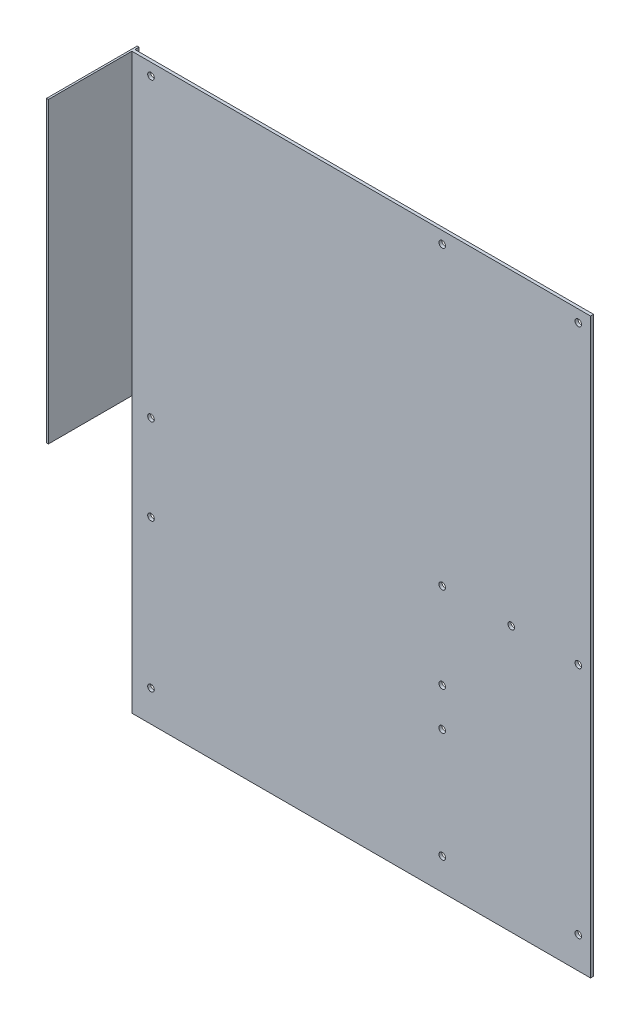
ISO-10303-21;
HEADER;
FILE_DESCRIPTION(('STEP AP214'),'2;1');
FILE_NAME('part.step','',(''),(''),'','','');
FILE_SCHEMA(('AUTOMOTIVE_DESIGN { 1 0 10303 214 1 1 1 1 }'));
ENDSEC;
DATA;
#1=APPLICATION_CONTEXT('core data for automotive mechanical design processes');
#2=APPLICATION_PROTOCOL_DEFINITION('international standard','automotive_design',2000,#1);
#3=PRODUCT_CONTEXT('',#1,'mechanical');
#4=PRODUCT('Part','Part','',(#3));
#5=PRODUCT_RELATED_PRODUCT_CATEGORY('part','',(#4));
#6=PRODUCT_DEFINITION_FORMATION('','',#4);
#7=PRODUCT_DEFINITION_CONTEXT('part definition',#1,'design');
#8=PRODUCT_DEFINITION('design','',#6,#7);
#9=PRODUCT_DEFINITION_SHAPE('','',#8);
#10=(LENGTH_UNIT() NAMED_UNIT(*) SI_UNIT(.MILLI.,.METRE.));
#11=(NAMED_UNIT(*) PLANE_ANGLE_UNIT() SI_UNIT($,.RADIAN.));
#12=(NAMED_UNIT(*) SI_UNIT($,.STERADIAN.) SOLID_ANGLE_UNIT());
#13=UNCERTAINTY_MEASURE_WITH_UNIT(LENGTH_MEASURE(1.E-05),#10,'distance_accuracy_value','');
#14=(GEOMETRIC_REPRESENTATION_CONTEXT(3) GLOBAL_UNCERTAINTY_ASSIGNED_CONTEXT((#13)) GLOBAL_UNIT_ASSIGNED_CONTEXT((#10,
#11,#12)) REPRESENTATION_CONTEXT('',''));
#15=CARTESIAN_POINT('',(0.,0.,0.));
#16=DIRECTION('',(0.,0.,1.));
#17=DIRECTION('',(1.,0.,0.));
#18=AXIS2_PLACEMENT_3D('',#15,#16,#17);
#19=CARTESIAN_POINT('',(0.,305.,1.6));
#20=DIRECTION('',(1.,0.,0.));
#21=DIRECTION('',(0.,0.,-1.));
#22=AXIS2_PLACEMENT_3D('',#19,#20,#21);
#23=PLANE('',#22);
#24=DIRECTION('',(0.,0.,1.));
#25=VECTOR('',#24,1.);
#26=CARTESIAN_POINT('',(0.,146.25,-2.21));
#27=LINE('',#26,#25);
#28=CARTESIAN_POINT('',(0.,146.25,0.));
#29=VERTEX_POINT('',#28);
#30=CARTESIAN_POINT('',(0.,146.25,1.6));
#31=VERTEX_POINT('',#30);
#32=EDGE_CURVE('E11',#29,#31,#27,.T.);
#33=ORIENTED_EDGE('',*,*,#32,.F.);
#34=DIRECTION('',(0.,-1.,0.));
#35=VECTOR('',#34,1.);
#36=CARTESIAN_POINT('',(0.,305.,0.));
#37=LINE('',#36,#35);
#38=CARTESIAN_POINT('',(0.,0.,0.));
#39=VERTEX_POINT('',#38);
#40=EDGE_CURVE('E288',#29,#39,#37,.T.);
#41=ORIENTED_EDGE('',*,*,#40,.T.);
#42=DIRECTION('',(0.,0.,-1.));
#43=VECTOR('',#42,1.);
#44=CARTESIAN_POINT('',(0.,0.,1.6));
#45=LINE('',#44,#43);
#46=CARTESIAN_POINT('',(0.,0.,1.6));
#47=VERTEX_POINT('',#46);
#48=EDGE_CURVE('E54',#47,#39,#45,.T.);
#49=ORIENTED_EDGE('',*,*,#48,.F.);
#50=DIRECTION('',(0.,-1.,0.));
#51=VECTOR('',#50,1.);
#52=CARTESIAN_POINT('',(0.,305.,1.6));
#53=LINE('',#52,#51);
#54=EDGE_CURVE('E102',#31,#47,#53,.T.);
#55=ORIENTED_EDGE('',*,*,#54,.F.);
#56=EDGE_LOOP('',(#33,#41,#49,#55));
#57=FACE_BOUND('',#56,.T.);
#58=ADVANCED_FACE('F51',(#57),#23,.F.);
#59=CARTESIAN_POINT('',(0.,0.,1.6));
#60=DIRECTION('',(0.,1.,0.));
#61=DIRECTION('',(0.,0.,1.));
#62=AXIS2_PLACEMENT_3D('',#59,#60,#61);
#63=PLANE('',#62);
#64=DIRECTION('',(1.,0.,0.));
#65=VECTOR('',#64,1.);
#66=CARTESIAN_POINT('',(0.,0.,0.));
#67=LINE('',#66,#65);
#68=CARTESIAN_POINT('',(244.,0.,0.));
#69=VERTEX_POINT('',#68);
#70=EDGE_CURVE('E307',#39,#69,#67,.T.);
#71=ORIENTED_EDGE('',*,*,#70,.T.);
#72=DIRECTION('',(0.,0.,-1.));
#73=VECTOR('',#72,1.);
#74=CARTESIAN_POINT('',(244.,0.,1.6));
#75=LINE('',#74,#73);
#76=CARTESIAN_POINT('',(244.,0.,1.6));
#77=VERTEX_POINT('',#76);
#78=EDGE_CURVE('E316',#77,#69,#75,.T.);
#79=ORIENTED_EDGE('',*,*,#78,.F.);
#80=DIRECTION('',(1.,0.,0.));
#81=VECTOR('',#80,1.);
#82=CARTESIAN_POINT('',(0.,0.,1.6));
#83=LINE('',#82,#81);
#84=EDGE_CURVE('E294',#47,#77,#83,.T.);
#85=ORIENTED_EDGE('',*,*,#84,.F.);
#86=ORIENTED_EDGE('',*,*,#48,.T.);
#87=EDGE_LOOP('',(#71,#79,#85,#86));
#88=FACE_BOUND('',#87,.T.);
#89=ADVANCED_FACE('F327',(#88),#63,.F.);
#90=CARTESIAN_POINT('',(244.,0.,1.6));
#91=DIRECTION('',(-1.,0.,0.));
#92=DIRECTION('',(0.,0.,1.));
#93=AXIS2_PLACEMENT_3D('',#90,#91,#92);
#94=PLANE('',#93);
#95=DIRECTION('',(0.,1.,0.));
#96=VECTOR('',#95,1.);
#97=CARTESIAN_POINT('',(244.,0.,0.));
#98=LINE('',#97,#96);
#99=CARTESIAN_POINT('',(244.,305.,0.));
#100=VERTEX_POINT('',#99);
#101=EDGE_CURVE('E310',#69,#100,#98,.T.);
#102=ORIENTED_EDGE('',*,*,#101,.T.);
#103=DIRECTION('',(0.,0.,-1.));
#104=VECTOR('',#103,1.);
#105=CARTESIAN_POINT('',(244.,305.,1.6));
#106=LINE('',#105,#104);
#107=CARTESIAN_POINT('',(244.,305.,1.6));
#108=VERTEX_POINT('',#107);
#109=EDGE_CURVE('E302',#108,#100,#106,.T.);
#110=ORIENTED_EDGE('',*,*,#109,.F.);
#111=DIRECTION('',(0.,1.,0.));
#112=VECTOR('',#111,1.);
#113=CARTESIAN_POINT('',(244.,0.,1.6));
#114=LINE('',#113,#112);
#115=EDGE_CURVE('E297',#77,#108,#114,.T.);
#116=ORIENTED_EDGE('',*,*,#115,.F.);
#117=ORIENTED_EDGE('',*,*,#78,.T.);
#118=EDGE_LOOP('',(#102,#110,#116,#117));
#119=FACE_BOUND('',#118,.T.);
#120=ADVANCED_FACE('F333',(#119),#94,.F.);
#121=CARTESIAN_POINT('',(244.,305.,1.6));
#122=DIRECTION('',(0.,-1.,0.));
#123=DIRECTION('',(1.,0.,0.));
#124=AXIS2_PLACEMENT_3D('',#121,#122,#123);
#125=PLANE('',#124);
#126=DIRECTION('',(-1.,0.,0.));
#127=VECTOR('',#126,1.);
#128=CARTESIAN_POINT('',(244.,305.,0.));
#129=LINE('',#128,#127);
#130=CARTESIAN_POINT('',(0.,305.,0.));
#131=VERTEX_POINT('',#130);
#132=EDGE_CURVE('E97',#100,#131,#129,.T.);
#133=ORIENTED_EDGE('',*,*,#132,.T.);
#134=DIRECTION('',(0.,0.,1.));
#135=VECTOR('',#134,1.);
#136=CARTESIAN_POINT('',(0.,305.,-2.21));
#137=LINE('',#136,#135);
#138=CARTESIAN_POINT('',(0.,305.,-2.21));
#139=VERTEX_POINT('',#138);
#140=EDGE_CURVE('E139',#139,#131,#137,.T.);
#141=ORIENTED_EDGE('',*,*,#140,.F.);
#142=DIRECTION('',(-1.,0.,0.));
#143=VECTOR('',#142,1.);
#144=CARTESIAN_POINT('',(0.,305.,-2.21));
#145=LINE('',#144,#143);
#146=CARTESIAN_POINT('',(-1.,305.,-2.21));
#147=VERTEX_POINT('',#146);
#148=EDGE_CURVE('E168',#139,#147,#145,.T.);
#149=ORIENTED_EDGE('',*,*,#148,.T.);
#150=DIRECTION('',(0.,0.,1.));
#151=VECTOR('',#150,1.);
#152=CARTESIAN_POINT('',(-1.,305.,-2.21));
#153=LINE('',#152,#151);
#154=CARTESIAN_POINT('',(-1.,305.,46.05));
#155=VERTEX_POINT('',#154);
#156=EDGE_CURVE('E146',#147,#155,#153,.T.);
#157=ORIENTED_EDGE('',*,*,#156,.T.);
#158=DIRECTION('',(-1.,0.,0.));
#159=VECTOR('',#158,1.);
#160=CARTESIAN_POINT('',(0.,305.,46.05));
#161=LINE('',#160,#159);
#162=CARTESIAN_POINT('',(0.,305.,46.05));
#163=VERTEX_POINT('',#162);
#164=EDGE_CURVE('E143',#163,#155,#161,.T.);
#165=ORIENTED_EDGE('',*,*,#164,.F.);
#166=CARTESIAN_POINT('',(0.,305.,1.6));
#167=VERTEX_POINT('',#166);
#168=EDGE_CURVE('E131',#167,#163,#137,.T.);
#169=ORIENTED_EDGE('',*,*,#168,.F.);
#170=DIRECTION('',(-1.,0.,0.));
#171=VECTOR('',#170,1.);
#172=CARTESIAN_POINT('',(244.,305.,1.6));
#173=LINE('',#172,#171);
#174=EDGE_CURVE('E76',#108,#167,#173,.T.);
#175=ORIENTED_EDGE('',*,*,#174,.F.);
#176=ORIENTED_EDGE('',*,*,#109,.T.);
#177=EDGE_LOOP('',(#133,#141,#149,#157,#165,#169,#175,#176));
#178=FACE_BOUND('',#177,.T.);
#179=ADVANCED_FACE('F144',(#178),#125,.F.);
#180=CARTESIAN_POINT('',(0.,0.,1.6));
#181=DIRECTION('',(0.,0.,1.));
#182=DIRECTION('',(1.,0.,0.));
#183=AXIS2_PLACEMENT_3D('',#180,#181,#182);
#184=PLANE('',#183);
#185=CARTESIAN_POINT('',(165.1,95.43,1.6));
#186=DIRECTION('',(0.,0.,1.));
#187=DIRECTION('',(1.,0.,0.));
#188=AXIS2_PLACEMENT_3D('',#185,#186,#187);
#189=CIRCLE('',#188,1.75000000000001);
#190=CARTESIAN_POINT('',(166.85,95.43,1.6));
#191=VERTEX_POINT('',#190);
#192=EDGE_CURVE('E236',#191,#191,#189,.T.);
#193=ORIENTED_EDGE('',*,*,#192,.F.);
#194=EDGE_LOOP('',(#193));
#195=FACE_BOUND('',#194,.T.);
#196=CARTESIAN_POINT('',(10.16,141.15,1.6));
#197=DIRECTION('',(0.,0.,1.));
#198=DIRECTION('',(1.,0.,0.));
#199=AXIS2_PLACEMENT_3D('',#196,#197,#198);
#200=CIRCLE('',#199,1.75);
#201=CARTESIAN_POINT('',(11.91,141.15,1.6));
#202=VERTEX_POINT('',#201);
#203=EDGE_CURVE('E245',#202,#202,#200,.T.);
#204=ORIENTED_EDGE('',*,*,#203,.F.);
#205=EDGE_LOOP('',(#204));
#206=FACE_BOUND('',#205,.T.);
#207=CARTESIAN_POINT('',(165.1,141.15,1.6));
#208=DIRECTION('',(0.,0.,1.));
#209=DIRECTION('',(1.,0.,0.));
#210=AXIS2_PLACEMENT_3D('',#207,#208,#209);
#211=CIRCLE('',#210,1.75000000000001);
#212=CARTESIAN_POINT('',(166.85,141.15,1.6));
#213=VERTEX_POINT('',#212);
#214=EDGE_CURVE('E220',#213,#213,#211,.T.);
#215=ORIENTED_EDGE('',*,*,#214,.F.);
#216=EDGE_LOOP('',(#215));
#217=FACE_BOUND('',#216,.T.);
#218=CARTESIAN_POINT('',(237.49,141.15,1.6));
#219=DIRECTION('',(0.,0.,1.));
#220=DIRECTION('',(1.,0.,0.));
#221=AXIS2_PLACEMENT_3D('',#218,#219,#220);
#222=CIRCLE('',#221,1.75000000000001);
#223=CARTESIAN_POINT('',(239.24,141.15,1.6));
#224=VERTEX_POINT('',#223);
#225=EDGE_CURVE('E229',#224,#224,#222,.T.);
#226=ORIENTED_EDGE('',*,*,#225,.F.);
#227=EDGE_LOOP('',(#226));
#228=FACE_BOUND('',#227,.T.);
#229=CARTESIAN_POINT('',(10.16,95.43,1.6));
#230=DIRECTION('',(0.,0.,1.));
#231=DIRECTION('',(1.,0.,0.));
#232=AXIS2_PLACEMENT_3D('',#229,#230,#231);
#233=CIRCLE('',#232,1.75);
#234=CARTESIAN_POINT('',(11.91,95.43,1.6));
#235=VERTEX_POINT('',#234);
#236=EDGE_CURVE('E277',#235,#235,#233,.T.);
#237=ORIENTED_EDGE('',*,*,#236,.F.);
#238=EDGE_LOOP('',(#237));
#239=FACE_BOUND('',#238,.T.);
#240=CARTESIAN_POINT('',(165.1,75.11,1.6));
#241=DIRECTION('',(0.,0.,1.));
#242=DIRECTION('',(1.,0.,0.));
#243=AXIS2_PLACEMENT_3D('',#240,#241,#242);
#244=CIRCLE('',#243,1.75000000000001);
#245=CARTESIAN_POINT('',(166.85,75.11,1.6));
#246=VERTEX_POINT('',#245);
#247=EDGE_CURVE('E269',#246,#246,#244,.T.);
#248=ORIENTED_EDGE('',*,*,#247,.F.);
#249=EDGE_LOOP('',(#248));
#250=FACE_BOUND('',#249,.T.);
#251=CARTESIAN_POINT('',(237.49,16.69,1.6));
#252=DIRECTION('',(0.,0.,1.));
#253=DIRECTION('',(1.,0.,0.));
#254=AXIS2_PLACEMENT_3D('',#251,#252,#253);
#255=CIRCLE('',#254,1.75000000000001);
#256=CARTESIAN_POINT('',(239.24,16.69,1.6));
#257=VERTEX_POINT('',#256);
#258=EDGE_CURVE('E261',#257,#257,#255,.T.);
#259=ORIENTED_EDGE('',*,*,#258,.F.);
#260=EDGE_LOOP('',(#259));
#261=FACE_BOUND('',#260,.T.);
#262=CARTESIAN_POINT('',(165.1,16.69,1.6));
#263=DIRECTION('',(0.,0.,1.));
#264=DIRECTION('',(1.,0.,0.));
#265=AXIS2_PLACEMENT_3D('',#262,#263,#264);
#266=CIRCLE('',#265,1.75000000000001);
#267=CARTESIAN_POINT('',(166.85,16.69,1.6));
#268=VERTEX_POINT('',#267);
#269=EDGE_CURVE('E252',#268,#268,#266,.T.);
#270=ORIENTED_EDGE('',*,*,#269,.F.);
#271=EDGE_LOOP('',(#270));
#272=FACE_BOUND('',#271,.T.);
#273=CARTESIAN_POINT('',(10.16,298.63,1.6));
#274=DIRECTION('',(0.,0.,1.));
#275=DIRECTION('',(1.,0.,0.));
#276=AXIS2_PLACEMENT_3D('',#273,#274,#275);
#277=CIRCLE('',#276,1.75);
#278=CARTESIAN_POINT('',(11.91,298.63,1.6));
#279=VERTEX_POINT('',#278);
#280=EDGE_CURVE('E188',#279,#279,#277,.T.);
#281=ORIENTED_EDGE('',*,*,#280,.F.);
#282=EDGE_LOOP('',(#281));
#283=FACE_BOUND('',#282,.T.);
#284=CARTESIAN_POINT('',(165.1,298.63,1.6));
#285=DIRECTION('',(0.,0.,1.));
#286=DIRECTION('',(1.,0.,0.));
#287=AXIS2_PLACEMENT_3D('',#284,#285,#286);
#288=CIRCLE('',#287,1.75000000000001);
#289=CARTESIAN_POINT('',(166.85,298.63,1.6));
#290=VERTEX_POINT('',#289);
#291=EDGE_CURVE('E197',#290,#290,#288,.T.);
#292=ORIENTED_EDGE('',*,*,#291,.F.);
#293=EDGE_LOOP('',(#292));
#294=FACE_BOUND('',#293,.T.);
#295=CARTESIAN_POINT('',(237.49,298.63,1.6));
#296=DIRECTION('',(0.,0.,1.));
#297=DIRECTION('',(1.,0.,0.));
#298=AXIS2_PLACEMENT_3D('',#295,#296,#297);
#299=CIRCLE('',#298,1.75000000000001);
#300=CARTESIAN_POINT('',(239.24,298.63,1.6));
#301=VERTEX_POINT('',#300);
#302=EDGE_CURVE('E205',#301,#301,#299,.T.);
#303=ORIENTED_EDGE('',*,*,#302,.F.);
#304=EDGE_LOOP('',(#303));
#305=FACE_BOUND('',#304,.T.);
#306=CARTESIAN_POINT('',(201.816,141.15,1.6));
#307=DIRECTION('',(0.,0.,1.));
#308=DIRECTION('',(1.,0.,0.));
#309=AXIS2_PLACEMENT_3D('',#306,#307,#308);
#310=CIRCLE('',#309,1.75000000000001);
#311=CARTESIAN_POINT('',(203.566,141.15,1.6));
#312=VERTEX_POINT('',#311);
#313=EDGE_CURVE('E213',#312,#312,#310,.T.);
#314=ORIENTED_EDGE('',*,*,#313,.F.);
#315=EDGE_LOOP('',(#314));
#316=FACE_BOUND('',#315,.T.);
#317=CARTESIAN_POINT('',(10.16,16.69,1.6));
#318=DIRECTION('',(0.,0.,1.));
#319=DIRECTION('',(1.,0.,0.));
#320=AXIS2_PLACEMENT_3D('',#317,#318,#319);
#321=CIRCLE('',#320,1.75);
#322=CARTESIAN_POINT('',(11.91,16.69,1.6));
#323=VERTEX_POINT('',#322);
#324=EDGE_CURVE('E256',#323,#323,#321,.T.);
#325=ORIENTED_EDGE('',*,*,#324,.F.);
#326=EDGE_LOOP('',(#325));
#327=FACE_BOUND('',#326,.T.);
#328=EDGE_CURVE('E137',#167,#31,#53,.T.);
#329=ORIENTED_EDGE('',*,*,#328,.T.);
#330=ORIENTED_EDGE('',*,*,#54,.T.);
#331=ORIENTED_EDGE('',*,*,#84,.T.);
#332=ORIENTED_EDGE('',*,*,#115,.T.);
#333=ORIENTED_EDGE('',*,*,#174,.T.);
#334=EDGE_LOOP('',(#329,#330,#331,#332,#333));
#335=FACE_BOUND('',#334,.T.);
#336=ADVANCED_FACE('F334',(#195,#206,#217,#228,#239,#250,#261,#272,#283,#294,#305,#316,#327,
#335),#184,.T.);
#337=CARTESIAN_POINT('',(0.,0.,0.));
#338=DIRECTION('',(0.,0.,1.));
#339=DIRECTION('',(1.,0.,0.));
#340=AXIS2_PLACEMENT_3D('',#337,#338,#339);
#341=PLANE('',#340);
#342=CARTESIAN_POINT('',(165.1,95.43,0.));
#343=DIRECTION('',(0.,0.,1.));
#344=DIRECTION('',(1.,0.,0.));
#345=AXIS2_PLACEMENT_3D('',#342,#343,#344);
#346=CIRCLE('',#345,1.75000000000001);
#347=CARTESIAN_POINT('',(166.85,95.43,0.));
#348=VERTEX_POINT('',#347);
#349=EDGE_CURVE('E241',#348,#348,#346,.T.);
#350=ORIENTED_EDGE('',*,*,#349,.T.);
#351=EDGE_LOOP('',(#350));
#352=FACE_BOUND('',#351,.T.);
#353=CARTESIAN_POINT('',(10.16,141.15,0.));
#354=DIRECTION('',(0.,0.,1.));
#355=DIRECTION('',(1.,0.,0.));
#356=AXIS2_PLACEMENT_3D('',#353,#354,#355);
#357=CIRCLE('',#356,1.75);
#358=CARTESIAN_POINT('',(11.91,141.15,0.));
#359=VERTEX_POINT('',#358);
#360=EDGE_CURVE('E224',#359,#359,#357,.T.);
#361=ORIENTED_EDGE('',*,*,#360,.T.);
#362=EDGE_LOOP('',(#361));
#363=FACE_BOUND('',#362,.T.);
#364=CARTESIAN_POINT('',(165.1,141.15,0.));
#365=DIRECTION('',(0.,0.,1.));
#366=DIRECTION('',(1.,0.,0.));
#367=AXIS2_PLACEMENT_3D('',#364,#365,#366);
#368=CIRCLE('',#367,1.75000000000001);
#369=CARTESIAN_POINT('',(166.85,141.15,0.));
#370=VERTEX_POINT('',#369);
#371=EDGE_CURVE('E225',#370,#370,#368,.T.);
#372=ORIENTED_EDGE('',*,*,#371,.T.);
#373=EDGE_LOOP('',(#372));
#374=FACE_BOUND('',#373,.T.);
#375=CARTESIAN_POINT('',(237.49,141.15,0.));
#376=DIRECTION('',(0.,0.,1.));
#377=DIRECTION('',(1.,0.,0.));
#378=AXIS2_PLACEMENT_3D('',#375,#376,#377);
#379=CIRCLE('',#378,1.75000000000001);
#380=CARTESIAN_POINT('',(239.24,141.15,0.));
#381=VERTEX_POINT('',#380);
#382=EDGE_CURVE('E192',#381,#381,#379,.T.);
#383=ORIENTED_EDGE('',*,*,#382,.T.);
#384=EDGE_LOOP('',(#383));
#385=FACE_BOUND('',#384,.T.);
#386=CARTESIAN_POINT('',(10.16,95.43,0.));
#387=DIRECTION('',(0.,0.,1.));
#388=DIRECTION('',(1.,0.,0.));
#389=AXIS2_PLACEMENT_3D('',#386,#387,#388);
#390=CIRCLE('',#389,1.75);
#391=CARTESIAN_POINT('',(11.91,95.43,0.));
#392=VERTEX_POINT('',#391);
#393=EDGE_CURVE('E240',#392,#392,#390,.T.);
#394=ORIENTED_EDGE('',*,*,#393,.T.);
#395=EDGE_LOOP('',(#394));
#396=FACE_BOUND('',#395,.T.);
#397=CARTESIAN_POINT('',(165.1,75.11,0.));
#398=DIRECTION('',(0.,0.,1.));
#399=DIRECTION('',(1.,0.,0.));
#400=AXIS2_PLACEMENT_3D('',#397,#398,#399);
#401=CIRCLE('',#400,1.75000000000001);
#402=CARTESIAN_POINT('',(166.85,75.11,0.));
#403=VERTEX_POINT('',#402);
#404=EDGE_CURVE('E273',#403,#403,#401,.T.);
#405=ORIENTED_EDGE('',*,*,#404,.T.);
#406=EDGE_LOOP('',(#405));
#407=FACE_BOUND('',#406,.T.);
#408=CARTESIAN_POINT('',(237.49,16.69,0.));
#409=DIRECTION('',(0.,0.,1.));
#410=DIRECTION('',(1.,0.,0.));
#411=AXIS2_PLACEMENT_3D('',#408,#409,#410);
#412=CIRCLE('',#411,1.75000000000001);
#413=CARTESIAN_POINT('',(239.24,16.69,0.));
#414=VERTEX_POINT('',#413);
#415=EDGE_CURVE('E265',#414,#414,#412,.T.);
#416=ORIENTED_EDGE('',*,*,#415,.T.);
#417=EDGE_LOOP('',(#416));
#418=FACE_BOUND('',#417,.T.);
#419=CARTESIAN_POINT('',(165.1,16.69,0.));
#420=DIRECTION('',(0.,0.,1.));
#421=DIRECTION('',(1.,0.,0.));
#422=AXIS2_PLACEMENT_3D('',#419,#420,#421);
#423=CIRCLE('',#422,1.75000000000001);
#424=CARTESIAN_POINT('',(166.85,16.69,0.));
#425=VERTEX_POINT('',#424);
#426=EDGE_CURVE('E257',#425,#425,#423,.T.);
#427=ORIENTED_EDGE('',*,*,#426,.T.);
#428=EDGE_LOOP('',(#427));
#429=FACE_BOUND('',#428,.T.);
#430=CARTESIAN_POINT('',(10.16,298.63,0.));
#431=DIRECTION('',(0.,0.,1.));
#432=DIRECTION('',(1.,0.,0.));
#433=AXIS2_PLACEMENT_3D('',#430,#431,#432);
#434=CIRCLE('',#433,1.75);
#435=CARTESIAN_POINT('',(11.91,298.63,0.));
#436=VERTEX_POINT('',#435);
#437=EDGE_CURVE('E193',#436,#436,#434,.T.);
#438=ORIENTED_EDGE('',*,*,#437,.T.);
#439=EDGE_LOOP('',(#438));
#440=FACE_BOUND('',#439,.T.);
#441=CARTESIAN_POINT('',(165.1,298.63,0.));
#442=DIRECTION('',(0.,0.,1.));
#443=DIRECTION('',(1.,0.,0.));
#444=AXIS2_PLACEMENT_3D('',#441,#442,#443);
#445=CIRCLE('',#444,1.75000000000001);
#446=CARTESIAN_POINT('',(166.85,298.63,0.));
#447=VERTEX_POINT('',#446);
#448=EDGE_CURVE('E201',#447,#447,#445,.T.);
#449=ORIENTED_EDGE('',*,*,#448,.T.);
#450=EDGE_LOOP('',(#449));
#451=FACE_BOUND('',#450,.T.);
#452=CARTESIAN_POINT('',(237.49,298.63,0.));
#453=DIRECTION('',(0.,0.,1.));
#454=DIRECTION('',(1.,0.,0.));
#455=AXIS2_PLACEMENT_3D('',#452,#453,#454);
#456=CIRCLE('',#455,1.75000000000001);
#457=CARTESIAN_POINT('',(239.24,298.63,0.));
#458=VERTEX_POINT('',#457);
#459=EDGE_CURVE('E209',#458,#458,#456,.T.);
#460=ORIENTED_EDGE('',*,*,#459,.T.);
#461=EDGE_LOOP('',(#460));
#462=FACE_BOUND('',#461,.T.);
#463=CARTESIAN_POINT('',(201.816,141.15,0.));
#464=DIRECTION('',(0.,0.,1.));
#465=DIRECTION('',(1.,0.,0.));
#466=AXIS2_PLACEMENT_3D('',#463,#464,#465);
#467=CIRCLE('',#466,1.75000000000001);
#468=CARTESIAN_POINT('',(203.566,141.15,0.));
#469=VERTEX_POINT('',#468);
#470=EDGE_CURVE('E180',#469,#469,#467,.T.);
#471=ORIENTED_EDGE('',*,*,#470,.T.);
#472=EDGE_LOOP('',(#471));
#473=FACE_BOUND('',#472,.T.);
#474=CARTESIAN_POINT('',(10.16,16.69,0.));
#475=DIRECTION('',(0.,0.,1.));
#476=DIRECTION('',(1.,0.,0.));
#477=AXIS2_PLACEMENT_3D('',#474,#475,#476);
#478=CIRCLE('',#477,1.75);
#479=CARTESIAN_POINT('',(11.91,16.69,0.));
#480=VERTEX_POINT('',#479);
#481=EDGE_CURVE('E284',#480,#480,#478,.T.);
#482=ORIENTED_EDGE('',*,*,#481,.T.);
#483=EDGE_LOOP('',(#482));
#484=FACE_BOUND('',#483,.T.);
#485=EDGE_CURVE('E303',#131,#29,#37,.T.);
#486=ORIENTED_EDGE('',*,*,#485,.F.);
#487=ORIENTED_EDGE('',*,*,#132,.F.);
#488=ORIENTED_EDGE('',*,*,#101,.F.);
#489=ORIENTED_EDGE('',*,*,#70,.F.);
#490=ORIENTED_EDGE('',*,*,#40,.F.);
#491=EDGE_LOOP('',(#486,#487,#488,#489,#490));
#492=FACE_BOUND('',#491,.T.);
#493=ADVANCED_FACE('F331',(#352,#363,#374,#385,#396,#407,#418,#429,#440,#451,#462,#473,#484,
#492),#341,.F.);
#494=CARTESIAN_POINT('',(10.16,16.69,0.));
#495=DIRECTION('',(0.,0.,1.));
#496=DIRECTION('',(1.,0.,0.));
#497=AXIS2_PLACEMENT_3D('',#494,#495,#496);
#498=CYLINDRICAL_SURFACE('',#497,1.75);
#499=ORIENTED_EDGE('',*,*,#481,.F.);
#500=EDGE_LOOP('',(#499));
#501=FACE_BOUND('',#500,.T.);
#502=ORIENTED_EDGE('',*,*,#324,.T.);
#503=EDGE_LOOP('',(#502));
#504=FACE_BOUND('',#503,.T.);
#505=ADVANCED_FACE('F342',(#501,#504),#498,.F.);
#506=CARTESIAN_POINT('',(201.816,141.15,0.));
#507=DIRECTION('',(0.,0.,1.));
#508=DIRECTION('',(1.,0.,0.));
#509=AXIS2_PLACEMENT_3D('',#506,#507,#508);
#510=CYLINDRICAL_SURFACE('',#509,1.75000000000001);
#511=ORIENTED_EDGE('',*,*,#470,.F.);
#512=EDGE_LOOP('',(#511));
#513=FACE_BOUND('',#512,.T.);
#514=ORIENTED_EDGE('',*,*,#313,.T.);
#515=EDGE_LOOP('',(#514));
#516=FACE_BOUND('',#515,.T.);
#517=ADVANCED_FACE('F579',(#513,#516),#510,.F.);
#518=CARTESIAN_POINT('',(237.49,298.63,0.));
#519=DIRECTION('',(0.,0.,1.));
#520=DIRECTION('',(1.,0.,0.));
#521=AXIS2_PLACEMENT_3D('',#518,#519,#520);
#522=CYLINDRICAL_SURFACE('',#521,1.75000000000001);
#523=ORIENTED_EDGE('',*,*,#459,.F.);
#524=EDGE_LOOP('',(#523));
#525=FACE_BOUND('',#524,.T.);
#526=ORIENTED_EDGE('',*,*,#302,.T.);
#527=EDGE_LOOP('',(#526));
#528=FACE_BOUND('',#527,.T.);
#529=ADVANCED_FACE('F569',(#525,#528),#522,.F.);
#530=CARTESIAN_POINT('',(165.1,298.63,0.));
#531=DIRECTION('',(0.,0.,1.));
#532=DIRECTION('',(1.,0.,0.));
#533=AXIS2_PLACEMENT_3D('',#530,#531,#532);
#534=CYLINDRICAL_SURFACE('',#533,1.75000000000001);
#535=ORIENTED_EDGE('',*,*,#448,.F.);
#536=EDGE_LOOP('',(#535));
#537=FACE_BOUND('',#536,.T.);
#538=ORIENTED_EDGE('',*,*,#291,.T.);
#539=EDGE_LOOP('',(#538));
#540=FACE_BOUND('',#539,.T.);
#541=ADVANCED_FACE('F559',(#537,#540),#534,.F.);
#542=CARTESIAN_POINT('',(10.16,298.63,0.));
#543=DIRECTION('',(0.,0.,1.));
#544=DIRECTION('',(1.,0.,0.));
#545=AXIS2_PLACEMENT_3D('',#542,#543,#544);
#546=CYLINDRICAL_SURFACE('',#545,1.75);
#547=ORIENTED_EDGE('',*,*,#437,.F.);
#548=EDGE_LOOP('',(#547));
#549=FACE_BOUND('',#548,.T.);
#550=ORIENTED_EDGE('',*,*,#280,.T.);
#551=EDGE_LOOP('',(#550));
#552=FACE_BOUND('',#551,.T.);
#553=ADVANCED_FACE('F549',(#549,#552),#546,.F.);
#554=CARTESIAN_POINT('',(165.1,16.69,0.));
#555=DIRECTION('',(0.,0.,1.));
#556=DIRECTION('',(1.,0.,0.));
#557=AXIS2_PLACEMENT_3D('',#554,#555,#556);
#558=CYLINDRICAL_SURFACE('',#557,1.75000000000001);
#559=ORIENTED_EDGE('',*,*,#426,.F.);
#560=EDGE_LOOP('',(#559));
#561=FACE_BOUND('',#560,.T.);
#562=ORIENTED_EDGE('',*,*,#269,.T.);
#563=EDGE_LOOP('',(#562));
#564=FACE_BOUND('',#563,.T.);
#565=ADVANCED_FACE('F539',(#561,#564),#558,.F.);
#566=CARTESIAN_POINT('',(237.49,16.69,0.));
#567=DIRECTION('',(0.,0.,1.));
#568=DIRECTION('',(1.,0.,0.));
#569=AXIS2_PLACEMENT_3D('',#566,#567,#568);
#570=CYLINDRICAL_SURFACE('',#569,1.75000000000001);
#571=ORIENTED_EDGE('',*,*,#415,.F.);
#572=EDGE_LOOP('',(#571));
#573=FACE_BOUND('',#572,.T.);
#574=ORIENTED_EDGE('',*,*,#258,.T.);
#575=EDGE_LOOP('',(#574));
#576=FACE_BOUND('',#575,.T.);
#577=ADVANCED_FACE('F529',(#573,#576),#570,.F.);
#578=CARTESIAN_POINT('',(165.1,75.11,0.));
#579=DIRECTION('',(0.,0.,1.));
#580=DIRECTION('',(1.,0.,0.));
#581=AXIS2_PLACEMENT_3D('',#578,#579,#580);
#582=CYLINDRICAL_SURFACE('',#581,1.75000000000001);
#583=ORIENTED_EDGE('',*,*,#404,.F.);
#584=EDGE_LOOP('',(#583));
#585=FACE_BOUND('',#584,.T.);
#586=ORIENTED_EDGE('',*,*,#247,.T.);
#587=EDGE_LOOP('',(#586));
#588=FACE_BOUND('',#587,.T.);
#589=ADVANCED_FACE('F519',(#585,#588),#582,.F.);
#590=CARTESIAN_POINT('',(10.16,95.43,0.));
#591=DIRECTION('',(0.,0.,1.));
#592=DIRECTION('',(1.,0.,0.));
#593=AXIS2_PLACEMENT_3D('',#590,#591,#592);
#594=CYLINDRICAL_SURFACE('',#593,1.75);
#595=ORIENTED_EDGE('',*,*,#393,.F.);
#596=EDGE_LOOP('',(#595));
#597=FACE_BOUND('',#596,.T.);
#598=ORIENTED_EDGE('',*,*,#236,.T.);
#599=EDGE_LOOP('',(#598));
#600=FACE_BOUND('',#599,.T.);
#601=ADVANCED_FACE('F509',(#597,#600),#594,.F.);
#602=CARTESIAN_POINT('',(237.49,141.15,0.));
#603=DIRECTION('',(0.,0.,1.));
#604=DIRECTION('',(1.,0.,0.));
#605=AXIS2_PLACEMENT_3D('',#602,#603,#604);
#606=CYLINDRICAL_SURFACE('',#605,1.75000000000001);
#607=ORIENTED_EDGE('',*,*,#382,.F.);
#608=EDGE_LOOP('',(#607));
#609=FACE_BOUND('',#608,.T.);
#610=ORIENTED_EDGE('',*,*,#225,.T.);
#611=EDGE_LOOP('',(#610));
#612=FACE_BOUND('',#611,.T.);
#613=ADVANCED_FACE('F499',(#609,#612),#606,.F.);
#614=CARTESIAN_POINT('',(165.1,141.15,0.));
#615=DIRECTION('',(0.,0.,1.));
#616=DIRECTION('',(1.,0.,0.));
#617=AXIS2_PLACEMENT_3D('',#614,#615,#616);
#618=CYLINDRICAL_SURFACE('',#617,1.75000000000001);
#619=ORIENTED_EDGE('',*,*,#371,.F.);
#620=EDGE_LOOP('',(#619));
#621=FACE_BOUND('',#620,.T.);
#622=ORIENTED_EDGE('',*,*,#214,.T.);
#623=EDGE_LOOP('',(#622));
#624=FACE_BOUND('',#623,.T.);
#625=ADVANCED_FACE('F489',(#621,#624),#618,.F.);
#626=CARTESIAN_POINT('',(10.16,141.15,0.));
#627=DIRECTION('',(0.,0.,1.));
#628=DIRECTION('',(1.,0.,0.));
#629=AXIS2_PLACEMENT_3D('',#626,#627,#628);
#630=CYLINDRICAL_SURFACE('',#629,1.75);
#631=ORIENTED_EDGE('',*,*,#360,.F.);
#632=EDGE_LOOP('',(#631));
#633=FACE_BOUND('',#632,.T.);
#634=ORIENTED_EDGE('',*,*,#203,.T.);
#635=EDGE_LOOP('',(#634));
#636=FACE_BOUND('',#635,.T.);
#637=ADVANCED_FACE('F479',(#633,#636),#630,.F.);
#638=CARTESIAN_POINT('',(165.1,95.43,0.));
#639=DIRECTION('',(0.,0.,1.));
#640=DIRECTION('',(1.,0.,0.));
#641=AXIS2_PLACEMENT_3D('',#638,#639,#640);
#642=CYLINDRICAL_SURFACE('',#641,1.75000000000001);
#643=ORIENTED_EDGE('',*,*,#349,.F.);
#644=EDGE_LOOP('',(#643));
#645=FACE_BOUND('',#644,.T.);
#646=ORIENTED_EDGE('',*,*,#192,.T.);
#647=EDGE_LOOP('',(#646));
#648=FACE_BOUND('',#647,.T.);
#649=ADVANCED_FACE('F383',(#645,#648),#642,.F.);
#650=CARTESIAN_POINT('',(0.,305.,-2.21));
#651=DIRECTION('',(1.,0.,0.));
#652=DIRECTION('',(0.,0.,-1.));
#653=AXIS2_PLACEMENT_3D('',#650,#651,#652);
#654=PLANE('',#653);
#655=ORIENTED_EDGE('',*,*,#328,.F.);
#656=ORIENTED_EDGE('',*,*,#168,.T.);
#657=DIRECTION('',(0.,1.,0.));
#658=VECTOR('',#657,1.);
#659=CARTESIAN_POINT('',(0.,305.,46.05));
#660=LINE('',#659,#658);
#661=CARTESIAN_POINT('',(0.,146.25,46.05));
#662=VERTEX_POINT('',#661);
#663=EDGE_CURVE('E136',#662,#163,#660,.T.);
#664=ORIENTED_EDGE('',*,*,#663,.F.);
#665=EDGE_CURVE('E62',#31,#662,#27,.T.);
#666=ORIENTED_EDGE('',*,*,#665,.F.);
#667=EDGE_LOOP('',(#655,#656,#664,#666));
#668=FACE_BOUND('',#667,.T.);
#669=ADVANCED_FACE('F133',(#668),#654,.T.);
#670=ORIENTED_EDGE('',*,*,#140,.T.);
#671=ORIENTED_EDGE('',*,*,#485,.T.);
#672=CARTESIAN_POINT('',(0.,146.25,-2.21));
#673=VERTEX_POINT('',#672);
#674=EDGE_CURVE('E61',#673,#29,#27,.T.);
#675=ORIENTED_EDGE('',*,*,#674,.F.);
#676=DIRECTION('',(0.,1.,0.));
#677=VECTOR('',#676,1.);
#678=CARTESIAN_POINT('',(0.,305.,-2.21));
#679=LINE('',#678,#677);
#680=EDGE_CURVE('E164',#673,#139,#679,.T.);
#681=ORIENTED_EDGE('',*,*,#680,.T.);
#682=EDGE_LOOP('',(#670,#671,#675,#681));
#683=FACE_BOUND('',#682,.T.);
#684=ADVANCED_FACE('F382',(#683),#654,.T.);
#685=CARTESIAN_POINT('',(-0.999999999999984,146.25,-2.21));
#686=DIRECTION('',(0.,-1.,0.));
#687=DIRECTION('',(0.,0.,-1.));
#688=AXIS2_PLACEMENT_3D('',#685,#686,#687);
#689=PLANE('',#688);
#690=ORIENTED_EDGE('',*,*,#674,.T.);
#691=ORIENTED_EDGE('',*,*,#32,.T.);
#692=ORIENTED_EDGE('',*,*,#665,.T.);
#693=DIRECTION('',(1.,0.,0.));
#694=VECTOR('',#693,1.);
#695=CARTESIAN_POINT('',(-0.999999999999984,146.25,46.05));
#696=LINE('',#695,#694);
#697=CARTESIAN_POINT('',(-0.999999999999984,146.25,46.05));
#698=VERTEX_POINT('',#697);
#699=EDGE_CURVE('E156',#698,#662,#696,.T.);
#700=ORIENTED_EDGE('',*,*,#699,.F.);
#701=DIRECTION('',(0.,0.,1.));
#702=VECTOR('',#701,1.);
#703=CARTESIAN_POINT('',(-0.999999999999984,146.25,-2.21));
#704=LINE('',#703,#702);
#705=CARTESIAN_POINT('',(-0.999999999999984,146.25,-2.21));
#706=VERTEX_POINT('',#705);
#707=EDGE_CURVE('E181',#706,#698,#704,.T.);
#708=ORIENTED_EDGE('',*,*,#707,.F.);
#709=DIRECTION('',(1.,0.,0.));
#710=VECTOR('',#709,1.);
#711=CARTESIAN_POINT('',(-0.999999999999984,146.25,-2.21));
#712=LINE('',#711,#710);
#713=EDGE_CURVE('E140',#706,#673,#712,.T.);
#714=ORIENTED_EDGE('',*,*,#713,.T.);
#715=EDGE_LOOP('',(#690,#691,#692,#700,#708,#714));
#716=FACE_BOUND('',#715,.T.);
#717=ADVANCED_FACE('F392',(#716),#689,.T.);
#718=CARTESIAN_POINT('',(-1.,305.,-2.21));
#719=DIRECTION('',(-1.,0.,0.));
#720=DIRECTION('',(0.,-1.,0.));
#721=AXIS2_PLACEMENT_3D('',#718,#719,#720);
#722=PLANE('',#721);
#723=ORIENTED_EDGE('',*,*,#707,.T.);
#724=DIRECTION('',(0.,-1.,0.));
#725=VECTOR('',#724,1.);
#726=CARTESIAN_POINT('',(-1.,305.,46.05));
#727=LINE('',#726,#725);
#728=EDGE_CURVE('E151',#155,#698,#727,.T.);
#729=ORIENTED_EDGE('',*,*,#728,.F.);
#730=ORIENTED_EDGE('',*,*,#156,.F.);
#731=DIRECTION('',(0.,-1.,0.));
#732=VECTOR('',#731,1.);
#733=CARTESIAN_POINT('',(-1.,305.,-2.21));
#734=LINE('',#733,#732);
#735=EDGE_CURVE('E171',#147,#706,#734,.T.);
#736=ORIENTED_EDGE('',*,*,#735,.T.);
#737=EDGE_LOOP('',(#723,#729,#730,#736));
#738=FACE_BOUND('',#737,.T.);
#739=ADVANCED_FACE('F401',(#738),#722,.T.);
#740=CARTESIAN_POINT('',(0.,0.,-2.21));
#741=DIRECTION('',(0.,0.,1.));
#742=DIRECTION('',(1.,0.,0.));
#743=AXIS2_PLACEMENT_3D('',#740,#741,#742);
#744=PLANE('',#743);
#745=ORIENTED_EDGE('',*,*,#680,.F.);
#746=ORIENTED_EDGE('',*,*,#713,.F.);
#747=ORIENTED_EDGE('',*,*,#735,.F.);
#748=ORIENTED_EDGE('',*,*,#148,.F.);
#749=EDGE_LOOP('',(#745,#746,#747,#748));
#750=FACE_BOUND('',#749,.T.);
#751=ADVANCED_FACE('F411',(#750),#744,.F.);
#752=CARTESIAN_POINT('',(0.,0.,46.05));
#753=DIRECTION('',(0.,0.,1.));
#754=DIRECTION('',(1.,0.,0.));
#755=AXIS2_PLACEMENT_3D('',#752,#753,#754);
#756=PLANE('',#755);
#757=ORIENTED_EDGE('',*,*,#663,.T.);
#758=ORIENTED_EDGE('',*,*,#164,.T.);
#759=ORIENTED_EDGE('',*,*,#728,.T.);
#760=ORIENTED_EDGE('',*,*,#699,.T.);
#761=EDGE_LOOP('',(#757,#758,#759,#760));
#762=FACE_BOUND('',#761,.T.);
#763=ADVANCED_FACE('F154',(#762),#756,.T.);
#764=CLOSED_SHELL('',(#58,#89,#120,#179,#336,#493,#505,#517,#529,#541,#553,#565,#577,#589,#601,
#613,#625,#637,#649,#669,#684,#717,#739,#751,#763));
#765=MANIFOLD_SOLID_BREP('B2',#764);
#766=ADVANCED_BREP_SHAPE_REPRESENTATION('',(#18,#765),#14);
#767=SHAPE_DEFINITION_REPRESENTATION(#9,#766);
ENDSEC;
END-ISO-10303-21;
